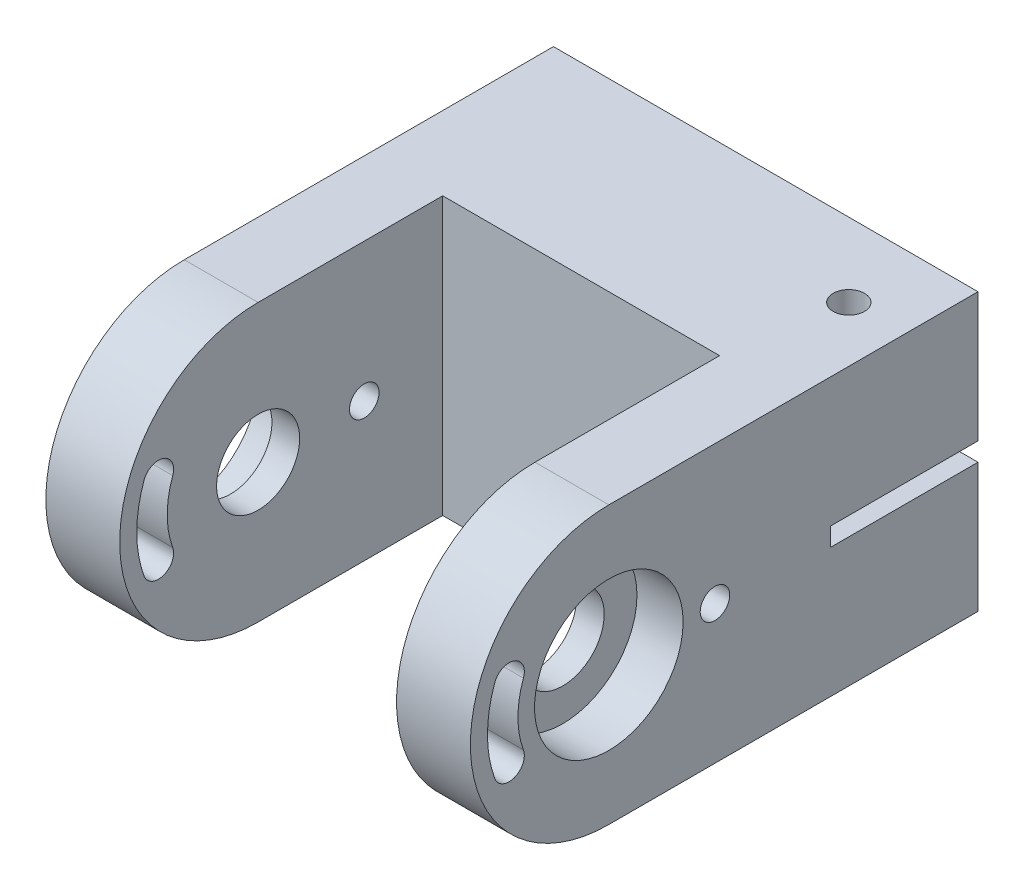
ISO-10303-21;
HEADER;
FILE_DESCRIPTION(('STEP AP214'),'2;1');
FILE_NAME('part.step','',(''),(''),'','','');
FILE_SCHEMA(('AUTOMOTIVE_DESIGN { 1 0 10303 214 1 1 1 1 }'));
ENDSEC;
DATA;
#1=APPLICATION_CONTEXT('core data for automotive mechanical design processes');
#2=APPLICATION_PROTOCOL_DEFINITION('international standard','automotive_design',2000,#1);
#3=PRODUCT_CONTEXT('',#1,'mechanical');
#4=PRODUCT('Part','Part','',(#3));
#5=PRODUCT_RELATED_PRODUCT_CATEGORY('part','',(#4));
#6=PRODUCT_DEFINITION_FORMATION('','',#4);
#7=PRODUCT_DEFINITION_CONTEXT('part definition',#1,'design');
#8=PRODUCT_DEFINITION('design','',#6,#7);
#9=PRODUCT_DEFINITION_SHAPE('','',#8);
#10=(LENGTH_UNIT() NAMED_UNIT(*) SI_UNIT(.MILLI.,.METRE.));
#11=(NAMED_UNIT(*) PLANE_ANGLE_UNIT() SI_UNIT($,.RADIAN.));
#12=(NAMED_UNIT(*) SI_UNIT($,.STERADIAN.) SOLID_ANGLE_UNIT());
#13=UNCERTAINTY_MEASURE_WITH_UNIT(LENGTH_MEASURE(1.E-05),#10,'distance_accuracy_value','');
#14=(GEOMETRIC_REPRESENTATION_CONTEXT(3) GLOBAL_UNCERTAINTY_ASSIGNED_CONTEXT((#13)) GLOBAL_UNIT_ASSIGNED_CONTEXT((#10,
#11,#12)) REPRESENTATION_CONTEXT('',''));
#15=CARTESIAN_POINT('',(0.,0.,0.));
#16=DIRECTION('',(0.,0.,1.));
#17=DIRECTION('',(1.,0.,0.));
#18=AXIS2_PLACEMENT_3D('',#15,#16,#17);
#19=CARTESIAN_POINT('',(18.,0.,0.));
#20=DIRECTION('',(1.,0.,0.));
#21=DIRECTION('',(0.,1.,0.));
#22=AXIS2_PLACEMENT_3D('',#19,#20,#21);
#23=PLANE('',#22);
#24=CARTESIAN_POINT('',(18.,0.,0.));
#25=DIRECTION('',(1.,0.,0.));
#26=DIRECTION('',(0.,0.,-1.));
#27=AXIS2_PLACEMENT_3D('',#24,#25,#26);
#28=CIRCLE('',#27,4.5);
#29=CARTESIAN_POINT('',(18.,0.,-4.5));
#30=VERTEX_POINT('',#29);
#31=EDGE_CURVE('E11',#30,#30,#28,.T.);
#32=ORIENTED_EDGE('',*,*,#31,.F.);
#33=EDGE_LOOP('',(#32));
#34=FACE_BOUND('',#33,.T.);
#35=CARTESIAN_POINT('',(18.,0.,0.));
#36=DIRECTION('',(1.,0.,0.));
#37=DIRECTION('',(0.,0.,-1.));
#38=AXIS2_PLACEMENT_3D('',#35,#36,#37);
#39=CIRCLE('',#38,8.05);
#40=CARTESIAN_POINT('',(18.,0.,-8.05));
#41=VERTEX_POINT('',#40);
#42=EDGE_CURVE('E26',#41,#41,#39,.T.);
#43=ORIENTED_EDGE('',*,*,#42,.T.);
#44=EDGE_LOOP('',(#43));
#45=FACE_BOUND('',#44,.T.);
#46=ADVANCED_FACE('F17',(#34,#45),#23,.T.);
#47=CARTESIAN_POINT('',(0.,0.,-22.));
#48=DIRECTION('',(0.,0.,1.));
#49=DIRECTION('',(1.,0.,0.));
#50=AXIS2_PLACEMENT_3D('',#47,#48,#49);
#51=PLANE('',#50);
#52=CARTESIAN_POINT('',(0.,0.,-22.));
#53=DIRECTION('',(0.,0.,1.));
#54=DIRECTION('',(1.,0.,0.));
#55=AXIS2_PLACEMENT_3D('',#52,#53,#54);
#56=CIRCLE('',#55,6.05);
#57=CARTESIAN_POINT('',(6.05,0.,-22.));
#58=VERTEX_POINT('',#57);
#59=EDGE_CURVE('E280',#58,#58,#56,.T.);
#60=ORIENTED_EDGE('',*,*,#59,.F.);
#61=EDGE_LOOP('',(#60));
#62=FACE_BOUND('',#61,.T.);
#63=ADVANCED_FACE('F520',(#62),#51,.F.);
#64=CARTESIAN_POINT('',(-27.,0.,0.));
#65=DIRECTION('',(1.,0.,0.));
#66=DIRECTION('',(0.,0.,-1.));
#67=AXIS2_PLACEMENT_3D('',#64,#65,#66);
#68=CYLINDRICAL_SURFACE('',#67,4.5);
#69=CARTESIAN_POINT('',(-15.,0.,0.));
#70=DIRECTION('',(1.,0.,0.));
#71=DIRECTION('',(0.,0.,-1.));
#72=AXIS2_PLACEMENT_3D('',#69,#70,#71);
#73=CIRCLE('',#72,4.5);
#74=CARTESIAN_POINT('',(-15.,0.,-4.5));
#75=VERTEX_POINT('',#74);
#76=EDGE_CURVE('E429',#75,#75,#73,.T.);
#77=ORIENTED_EDGE('',*,*,#76,.T.);
#78=EDGE_LOOP('',(#77));
#79=FACE_BOUND('',#78,.T.);
#80=CARTESIAN_POINT('',(-18.,0.,0.));
#81=DIRECTION('',(1.,0.,0.));
#82=DIRECTION('',(0.,0.,-1.));
#83=AXIS2_PLACEMENT_3D('',#80,#81,#82);
#84=CIRCLE('',#83,4.5);
#85=CARTESIAN_POINT('',(-18.,0.,-4.5));
#86=VERTEX_POINT('',#85);
#87=EDGE_CURVE('E279',#86,#86,#84,.T.);
#88=ORIENTED_EDGE('',*,*,#87,.F.);
#89=EDGE_LOOP('',(#88));
#90=FACE_BOUND('',#89,.T.);
#91=ADVANCED_FACE('F525',(#79,#90),#68,.F.);
#92=CARTESIAN_POINT('',(11.,0.,0.));
#93=DIRECTION('',(1.,0.,0.));
#94=DIRECTION('',(0.,0.,-1.));
#95=AXIS2_PLACEMENT_3D('',#92,#93,#94);
#96=CYLINDRICAL_SURFACE('',#95,4.5);
#97=ORIENTED_EDGE('',*,*,#31,.T.);
#98=EDGE_LOOP('',(#97));
#99=FACE_BOUND('',#98,.T.);
#100=CARTESIAN_POINT('',(15.,0.,0.));
#101=DIRECTION('',(1.,0.,0.));
#102=DIRECTION('',(0.,0.,-1.));
#103=AXIS2_PLACEMENT_3D('',#100,#101,#102);
#104=CIRCLE('',#103,4.5);
#105=CARTESIAN_POINT('',(15.,0.,-4.5));
#106=VERTEX_POINT('',#105);
#107=EDGE_CURVE('E338',#106,#106,#104,.T.);
#108=ORIENTED_EDGE('',*,*,#107,.F.);
#109=EDGE_LOOP('',(#108));
#110=FACE_BOUND('',#109,.T.);
#111=ADVANCED_FACE('F533',(#99,#110),#96,.F.);
#112=CARTESIAN_POINT('',(18.,0.,0.));
#113=DIRECTION('',(1.,0.,0.));
#114=DIRECTION('',(0.,0.,-1.));
#115=AXIS2_PLACEMENT_3D('',#112,#113,#114);
#116=CYLINDRICAL_SURFACE('',#115,8.05);
#117=CARTESIAN_POINT('',(23.,0.,0.));
#118=DIRECTION('',(1.,0.,0.));
#119=DIRECTION('',(0.,0.,-1.));
#120=AXIS2_PLACEMENT_3D('',#117,#118,#119);
#121=CIRCLE('',#120,8.05);
#122=CARTESIAN_POINT('',(23.,0.,-8.05));
#123=VERTEX_POINT('',#122);
#124=EDGE_CURVE('E332',#123,#123,#121,.T.);
#125=ORIENTED_EDGE('',*,*,#124,.T.);
#126=EDGE_LOOP('',(#125));
#127=FACE_BOUND('',#126,.T.);
#128=ORIENTED_EDGE('',*,*,#42,.F.);
#129=EDGE_LOOP('',(#128));
#130=FACE_BOUND('',#129,.T.);
#131=ADVANCED_FACE('F531',(#127,#130),#116,.F.);
#132=CARTESIAN_POINT('',(7.,0.,-11.5));
#133=DIRECTION('',(1.,0.,0.));
#134=DIRECTION('',(0.,1.,0.));
#135=AXIS2_PLACEMENT_3D('',#132,#133,#134);
#136=CYLINDRICAL_SURFACE('',#135,1.6);
#137=CARTESIAN_POINT('',(23.,0.,-11.5));
#138=DIRECTION('',(1.,0.,0.));
#139=DIRECTION('',(0.,1.,0.));
#140=AXIS2_PLACEMENT_3D('',#137,#138,#139);
#141=CIRCLE('',#140,1.6);
#142=CARTESIAN_POINT('',(23.,1.6,-11.5));
#143=VERTEX_POINT('',#142);
#144=EDGE_CURVE('E437',#143,#143,#141,.T.);
#145=ORIENTED_EDGE('',*,*,#144,.T.);
#146=EDGE_LOOP('',(#145));
#147=FACE_BOUND('',#146,.T.);
#148=CARTESIAN_POINT('',(15.,0.,-11.5));
#149=DIRECTION('',(1.,0.,0.));
#150=DIRECTION('',(0.,1.,0.));
#151=AXIS2_PLACEMENT_3D('',#148,#149,#150);
#152=CIRCLE('',#151,1.6);
#153=CARTESIAN_POINT('',(15.,1.6,-11.5));
#154=VERTEX_POINT('',#153);
#155=EDGE_CURVE('E343',#154,#154,#152,.T.);
#156=ORIENTED_EDGE('',*,*,#155,.F.);
#157=EDGE_LOOP('',(#156));
#158=FACE_BOUND('',#157,.T.);
#159=ADVANCED_FACE('F517',(#147,#158),#136,.F.);
#160=CARTESIAN_POINT('',(7.,0.,0.));
#161=DIRECTION('',(-1.,0.,0.));
#162=DIRECTION('',(0.,1.,0.));
#163=AXIS2_PLACEMENT_3D('',#160,#161,#162);
#164=CYLINDRICAL_SURFACE('',#163,13.15);
#165=DIRECTION('',(1.,0.,0.));
#166=VECTOR('',#165,1.);
#167=CARTESIAN_POINT('',(7.,-4.497564884733,12.356957963335));
#168=LINE('',#167,#166);
#169=CARTESIAN_POINT('',(15.,-4.497564884733,12.356957963335));
#170=VERTEX_POINT('',#169);
#171=CARTESIAN_POINT('',(23.,-4.497564884733,12.356957963335));
#172=VERTEX_POINT('',#171);
#173=EDGE_CURVE('E456',#170,#172,#168,.T.);
#174=ORIENTED_EDGE('',*,*,#173,.F.);
#175=CARTESIAN_POINT('',(15.,0.,0.));
#176=DIRECTION('',(-1.,0.,0.));
#177=DIRECTION('',(0.,1.,0.));
#178=AXIS2_PLACEMENT_3D('',#175,#176,#177);
#179=CIRCLE('',#178,13.15);
#180=CARTESIAN_POINT('',(15.,4.497564884733,12.356957963335));
#181=VERTEX_POINT('',#180);
#182=EDGE_CURVE('E420',#170,#181,#179,.T.);
#183=ORIENTED_EDGE('',*,*,#182,.T.);
#184=DIRECTION('',(1.,0.,0.));
#185=VECTOR('',#184,1.);
#186=CARTESIAN_POINT('',(7.,4.497564884733,12.356957963335));
#187=LINE('',#186,#185);
#188=CARTESIAN_POINT('',(23.,4.497564884733,12.356957963335));
#189=VERTEX_POINT('',#188);
#190=EDGE_CURVE('E453',#181,#189,#187,.T.);
#191=ORIENTED_EDGE('',*,*,#190,.T.);
#192=CARTESIAN_POINT('',(23.,0.,0.));
#193=DIRECTION('',(-1.,0.,0.));
#194=DIRECTION('',(0.,1.,0.));
#195=AXIS2_PLACEMENT_3D('',#192,#193,#194);
#196=CIRCLE('',#195,13.15);
#197=EDGE_CURVE('E426',#172,#189,#196,.T.);
#198=ORIENTED_EDGE('',*,*,#197,.F.);
#199=EDGE_LOOP('',(#174,#183,#191,#198));
#200=FACE_BOUND('',#199,.T.);
#201=ADVANCED_FACE('F496',(#200),#164,.F.);
#202=CARTESIAN_POINT('',(7.,3.933231648245,10.806465139038));
#203=DIRECTION('',(-1.,0.,0.));
#204=DIRECTION('',(0.,-0.939692620785813,0.342020143325932));
#205=AXIS2_PLACEMENT_3D('',#202,#203,#204);
#206=CYLINDRICAL_SURFACE('',#205,1.65);
#207=DIRECTION('',(1.,0.,0.));
#208=VECTOR('',#207,1.);
#209=CARTESIAN_POINT('',(7.,3.368898411758,9.255972314741));
#210=LINE('',#209,#208);
#211=CARTESIAN_POINT('',(15.,3.368898411758,9.255972314741));
#212=VERTEX_POINT('',#211);
#213=CARTESIAN_POINT('',(23.,3.368898411758,9.255972314741));
#214=VERTEX_POINT('',#213);
#215=EDGE_CURVE('E402',#212,#214,#210,.T.);
#216=ORIENTED_EDGE('',*,*,#215,.T.);
#217=CARTESIAN_POINT('',(23.,3.933231648245,10.806465139038));
#218=DIRECTION('',(-1.,0.,0.));
#219=DIRECTION('',(0.,-0.939692620785813,0.342020143325932));
#220=AXIS2_PLACEMENT_3D('',#217,#218,#219);
#221=CIRCLE('',#220,1.65);
#222=EDGE_CURVE('E433',#189,#214,#221,.T.);
#223=ORIENTED_EDGE('',*,*,#222,.F.);
#224=ORIENTED_EDGE('',*,*,#190,.F.);
#225=CARTESIAN_POINT('',(15.,3.933231648245,10.806465139038));
#226=DIRECTION('',(-1.,0.,0.));
#227=DIRECTION('',(0.,-0.939692620785813,0.342020143325932));
#228=AXIS2_PLACEMENT_3D('',#225,#226,#227);
#229=CIRCLE('',#228,1.65);
#230=EDGE_CURVE('E416',#181,#212,#229,.T.);
#231=ORIENTED_EDGE('',*,*,#230,.T.);
#232=EDGE_LOOP('',(#216,#223,#224,#231));
#233=FACE_BOUND('',#232,.T.);
#234=ADVANCED_FACE('F508',(#233),#206,.F.);
#235=CARTESIAN_POINT('',(7.,-3.933231648245,10.806465139038));
#236=DIRECTION('',(-1.,0.,0.));
#237=DIRECTION('',(0.,0.939692620785813,0.342020143325932));
#238=AXIS2_PLACEMENT_3D('',#235,#236,#237);
#239=CYLINDRICAL_SURFACE('',#238,1.65);
#240=ORIENTED_EDGE('',*,*,#173,.T.);
#241=CARTESIAN_POINT('',(23.,-3.933231648245,10.806465139038));
#242=DIRECTION('',(-1.,0.,0.));
#243=DIRECTION('',(0.,0.939692620785813,0.342020143325932));
#244=AXIS2_PLACEMENT_3D('',#241,#242,#243);
#245=CIRCLE('',#244,1.65);
#246=CARTESIAN_POINT('',(23.,-3.368898411758,9.255972314741));
#247=VERTEX_POINT('',#246);
#248=EDGE_CURVE('E271',#247,#172,#245,.T.);
#249=ORIENTED_EDGE('',*,*,#248,.F.);
#250=DIRECTION('',(1.,0.,0.));
#251=VECTOR('',#250,1.);
#252=CARTESIAN_POINT('',(7.,-3.368898411758,9.255972314741));
#253=LINE('',#252,#251);
#254=CARTESIAN_POINT('',(15.,-3.368898411758,9.255972314741));
#255=VERTEX_POINT('',#254);
#256=EDGE_CURVE('E309',#255,#247,#253,.T.);
#257=ORIENTED_EDGE('',*,*,#256,.F.);
#258=CARTESIAN_POINT('',(15.,-3.933231648245,10.806465139038));
#259=DIRECTION('',(-1.,0.,0.));
#260=DIRECTION('',(0.,0.939692620785813,0.342020143325932));
#261=AXIS2_PLACEMENT_3D('',#258,#259,#260);
#262=CIRCLE('',#261,1.65);
#263=EDGE_CURVE('E449',#255,#170,#262,.T.);
#264=ORIENTED_EDGE('',*,*,#263,.T.);
#265=EDGE_LOOP('',(#240,#249,#257,#264));
#266=FACE_BOUND('',#265,.T.);
#267=ADVANCED_FACE('F492',(#266),#239,.F.);
#268=CARTESIAN_POINT('',(7.,0.,0.));
#269=DIRECTION('',(-1.,0.,0.));
#270=DIRECTION('',(0.,1.,0.));
#271=AXIS2_PLACEMENT_3D('',#268,#269,#270);
#272=CYLINDRICAL_SURFACE('',#271,9.85);
#273=ORIENTED_EDGE('',*,*,#256,.T.);
#274=CARTESIAN_POINT('',(23.,0.,0.));
#275=DIRECTION('',(-1.,0.,0.));
#276=DIRECTION('',(0.,1.,0.));
#277=AXIS2_PLACEMENT_3D('',#274,#275,#276);
#278=CIRCLE('',#277,9.85);
#279=EDGE_CURVE('E267',#247,#214,#278,.T.);
#280=ORIENTED_EDGE('',*,*,#279,.T.);
#281=ORIENTED_EDGE('',*,*,#215,.F.);
#282=CARTESIAN_POINT('',(15.,0.,0.));
#283=DIRECTION('',(-1.,0.,0.));
#284=DIRECTION('',(0.,1.,0.));
#285=AXIS2_PLACEMENT_3D('',#282,#283,#284);
#286=CIRCLE('',#285,9.85);
#287=EDGE_CURVE('E460',#255,#212,#286,.T.);
#288=ORIENTED_EDGE('',*,*,#287,.F.);
#289=EDGE_LOOP('',(#273,#280,#281,#288));
#290=FACE_BOUND('',#289,.T.);
#291=ADVANCED_FACE('F501',(#290),#272,.T.);
#292=CARTESIAN_POINT('',(3.,-1.,-24.));
#293=DIRECTION('',(0.,0.,1.));
#294=DIRECTION('',(1.,0.,0.));
#295=AXIS2_PLACEMENT_3D('',#292,#293,#294);
#296=PLANE('',#295);
#297=DIRECTION('',(0.,-1.,0.));
#298=VECTOR('',#297,1.);
#299=CARTESIAN_POINT('',(23.,-8.,-24.));
#300=LINE('',#299,#298);
#301=CARTESIAN_POINT('',(23.,1.,-24.));
#302=VERTEX_POINT('',#301);
#303=CARTESIAN_POINT('',(23.,-1.,-24.));
#304=VERTEX_POINT('',#303);
#305=EDGE_CURVE('E382',#302,#304,#300,.T.);
#306=ORIENTED_EDGE('',*,*,#305,.T.);
#307=DIRECTION('',(1.,0.,0.));
#308=VECTOR('',#307,1.);
#309=CARTESIAN_POINT('',(3.,-1.,-24.));
#310=LINE('',#309,#308);
#311=CARTESIAN_POINT('',(5.966783052869,-1.,-24.));
#312=VERTEX_POINT('',#311);
#313=EDGE_CURVE('E37',#312,#304,#310,.T.);
#314=ORIENTED_EDGE('',*,*,#313,.F.);
#315=CARTESIAN_POINT('',(0.,0.,-24.));
#316=DIRECTION('',(0.,0.,1.));
#317=DIRECTION('',(1.,0.,0.));
#318=AXIS2_PLACEMENT_3D('',#315,#316,#317);
#319=CIRCLE('',#318,6.05);
#320=CARTESIAN_POINT('',(5.966783052869,1.,-24.));
#321=VERTEX_POINT('',#320);
#322=EDGE_CURVE('E374',#312,#321,#319,.T.);
#323=ORIENTED_EDGE('',*,*,#322,.T.);
#324=DIRECTION('',(1.,0.,0.));
#325=VECTOR('',#324,1.);
#326=CARTESIAN_POINT('',(3.,1.,-24.));
#327=LINE('',#326,#325);
#328=EDGE_CURVE('E327',#321,#302,#327,.T.);
#329=ORIENTED_EDGE('',*,*,#328,.T.);
#330=EDGE_LOOP('',(#306,#314,#323,#329));
#331=FACE_BOUND('',#330,.T.);
#332=ADVANCED_FACE('F557',(#331),#296,.F.);
#333=CARTESIAN_POINT('',(-18.,0.,0.));
#334=DIRECTION('',(1.,0.,0.));
#335=DIRECTION('',(0.,1.,0.));
#336=AXIS2_PLACEMENT_3D('',#333,#334,#335);
#337=PLANE('',#336);
#338=ORIENTED_EDGE('',*,*,#87,.T.);
#339=EDGE_LOOP('',(#338));
#340=FACE_BOUND('',#339,.T.);
#341=CARTESIAN_POINT('',(-18.,0.,0.));
#342=DIRECTION('',(1.,0.,0.));
#343=DIRECTION('',(0.,0.,-1.));
#344=AXIS2_PLACEMENT_3D('',#341,#342,#343);
#345=CIRCLE('',#344,8.05);
#346=CARTESIAN_POINT('',(-18.,0.,-8.05));
#347=VERTEX_POINT('',#346);
#348=EDGE_CURVE('E406',#347,#347,#345,.T.);
#349=ORIENTED_EDGE('',*,*,#348,.F.);
#350=EDGE_LOOP('',(#349));
#351=FACE_BOUND('',#350,.T.);
#352=ADVANCED_FACE('F553',(#340,#351),#337,.F.);
#353=CARTESIAN_POINT('',(17.,16.,-32.));
#354=DIRECTION('',(0.,-1.,0.));
#355=DIRECTION('',(1.,0.,0.));
#356=AXIS2_PLACEMENT_3D('',#353,#354,#355);
#357=CYLINDRICAL_SURFACE('',#356,1.7);
#358=CARTESIAN_POINT('',(17.,1.,-32.));
#359=DIRECTION('',(0.,-1.,0.));
#360=DIRECTION('',(1.,0.,0.));
#361=AXIS2_PLACEMENT_3D('',#358,#359,#360);
#362=CIRCLE('',#361,1.7);
#363=CARTESIAN_POINT('',(18.7,1.,-32.));
#364=VERTEX_POINT('',#363);
#365=EDGE_CURVE('E326',#364,#364,#362,.T.);
#366=ORIENTED_EDGE('',*,*,#365,.T.);
#367=EDGE_LOOP('',(#366));
#368=FACE_BOUND('',#367,.T.);
#369=CARTESIAN_POINT('',(17.,15.,-32.));
#370=DIRECTION('',(0.,-1.,0.));
#371=DIRECTION('',(1.,0.,0.));
#372=AXIS2_PLACEMENT_3D('',#369,#370,#371);
#373=CIRCLE('',#372,1.7);
#374=CARTESIAN_POINT('',(18.7,15.,-32.));
#375=VERTEX_POINT('',#374);
#376=EDGE_CURVE('E357',#375,#375,#373,.T.);
#377=ORIENTED_EDGE('',*,*,#376,.F.);
#378=EDGE_LOOP('',(#377));
#379=FACE_BOUND('',#378,.T.);
#380=ADVANCED_FACE('F556',(#368,#379),#357,.F.);
#381=CARTESIAN_POINT('',(3.,-1.,-40.));
#382=DIRECTION('',(0.,1.,0.));
#383=DIRECTION('',(1.,0.,0.));
#384=AXIS2_PLACEMENT_3D('',#381,#382,#383);
#385=PLANE('',#384);
#386=CARTESIAN_POINT('',(17.,-1.,-32.));
#387=DIRECTION('',(0.,-1.,0.));
#388=DIRECTION('',(1.,0.,0.));
#389=AXIS2_PLACEMENT_3D('',#386,#387,#388);
#390=CIRCLE('',#389,1.7);
#391=CARTESIAN_POINT('',(18.7,-1.,-32.));
#392=VERTEX_POINT('',#391);
#393=EDGE_CURVE('E470',#392,#392,#390,.T.);
#394=ORIENTED_EDGE('',*,*,#393,.T.);
#395=EDGE_LOOP('',(#394));
#396=FACE_BOUND('',#395,.T.);
#397=DIRECTION('',(1.,0.,0.));
#398=VECTOR('',#397,1.);
#399=CARTESIAN_POINT('',(3.,-1.,-40.));
#400=LINE('',#399,#398);
#401=CARTESIAN_POINT('',(5.966783052869,-1.,-40.));
#402=VERTEX_POINT('',#401);
#403=CARTESIAN_POINT('',(23.,-1.,-40.));
#404=VERTEX_POINT('',#403);
#405=EDGE_CURVE('E317',#402,#404,#400,.T.);
#406=ORIENTED_EDGE('',*,*,#405,.F.);
#407=DIRECTION('',(0.,0.,1.));
#408=VECTOR('',#407,1.);
#409=CARTESIAN_POINT('',(5.966783052869,-1.,-40.));
#410=LINE('',#409,#408);
#411=EDGE_CURVE('E474',#402,#312,#410,.T.);
#412=ORIENTED_EDGE('',*,*,#411,.T.);
#413=ORIENTED_EDGE('',*,*,#313,.T.);
#414=DIRECTION('',(0.,0.,1.));
#415=VECTOR('',#414,1.);
#416=CARTESIAN_POINT('',(23.,-1.,-40.));
#417=LINE('',#416,#415);
#418=EDGE_CURVE('E410',#404,#304,#417,.T.);
#419=ORIENTED_EDGE('',*,*,#418,.F.);
#420=EDGE_LOOP('',(#406,#412,#413,#419));
#421=FACE_BOUND('',#420,.T.);
#422=ADVANCED_FACE('F626',(#396,#421),#385,.T.);
#423=CARTESIAN_POINT('',(0.,0.,-40.));
#424=DIRECTION('',(0.,0.,1.));
#425=DIRECTION('',(1.,0.,0.));
#426=AXIS2_PLACEMENT_3D('',#423,#424,#425);
#427=CYLINDRICAL_SURFACE('',#426,6.05);
#428=ORIENTED_EDGE('',*,*,#59,.T.);
#429=EDGE_LOOP('',(#428));
#430=FACE_BOUND('',#429,.T.);
#431=ORIENTED_EDGE('',*,*,#322,.F.);
#432=ORIENTED_EDGE('',*,*,#411,.F.);
#433=CARTESIAN_POINT('',(0.,0.,-40.));
#434=DIRECTION('',(0.,0.,1.));
#435=DIRECTION('',(1.,0.,0.));
#436=AXIS2_PLACEMENT_3D('',#433,#434,#435);
#437=CIRCLE('',#436,6.05);
#438=CARTESIAN_POINT('',(5.966783052869,1.,-40.));
#439=VERTEX_POINT('',#438);
#440=EDGE_CURVE('E313',#439,#402,#437,.T.);
#441=ORIENTED_EDGE('',*,*,#440,.F.);
#442=DIRECTION('',(0.,0.,1.));
#443=VECTOR('',#442,1.);
#444=CARTESIAN_POINT('',(5.966783052869,1.,-40.));
#445=LINE('',#444,#443);
#446=EDGE_CURVE('E322',#439,#321,#445,.T.);
#447=ORIENTED_EDGE('',*,*,#446,.T.);
#448=EDGE_LOOP('',(#431,#432,#441,#447));
#449=FACE_BOUND('',#448,.T.);
#450=ADVANCED_FACE('F624',(#430,#449),#427,.F.);
#451=CARTESIAN_POINT('',(3.,1.,-40.));
#452=DIRECTION('',(0.,1.,0.));
#453=DIRECTION('',(1.,0.,0.));
#454=AXIS2_PLACEMENT_3D('',#451,#452,#453);
#455=PLANE('',#454);
#456=ORIENTED_EDGE('',*,*,#365,.F.);
#457=EDGE_LOOP('',(#456));
#458=FACE_BOUND('',#457,.T.);
#459=DIRECTION('',(0.,0.,1.));
#460=VECTOR('',#459,1.);
#461=CARTESIAN_POINT('',(23.,1.,-40.));
#462=LINE('',#461,#460);
#463=CARTESIAN_POINT('',(23.,1.,-40.));
#464=VERTEX_POINT('',#463);
#465=EDGE_CURVE('E378',#464,#302,#462,.T.);
#466=ORIENTED_EDGE('',*,*,#465,.T.);
#467=ORIENTED_EDGE('',*,*,#328,.F.);
#468=ORIENTED_EDGE('',*,*,#446,.F.);
#469=DIRECTION('',(1.,0.,0.));
#470=VECTOR('',#469,1.);
#471=CARTESIAN_POINT('',(3.,1.,-40.));
#472=LINE('',#471,#470);
#473=EDGE_CURVE('E305',#439,#464,#472,.T.);
#474=ORIENTED_EDGE('',*,*,#473,.T.);
#475=EDGE_LOOP('',(#466,#467,#468,#474));
#476=FACE_BOUND('',#475,.T.);
#477=ADVANCED_FACE('F619',(#458,#476),#455,.F.);
#478=CARTESIAN_POINT('',(17.,16.,-32.));
#479=DIRECTION('',(0.,-1.,0.));
#480=DIRECTION('',(1.,0.,0.));
#481=AXIS2_PLACEMENT_3D('',#478,#479,#480);
#482=CYLINDRICAL_SURFACE('',#481,1.7);
#483=CARTESIAN_POINT('',(17.,-15.,-32.));
#484=DIRECTION('',(0.,-1.,0.));
#485=DIRECTION('',(1.,0.,0.));
#486=AXIS2_PLACEMENT_3D('',#483,#484,#485);
#487=CIRCLE('',#486,1.7);
#488=CARTESIAN_POINT('',(18.7,-15.,-32.));
#489=VERTEX_POINT('',#488);
#490=EDGE_CURVE('E297',#489,#489,#487,.T.);
#491=ORIENTED_EDGE('',*,*,#490,.T.);
#492=EDGE_LOOP('',(#491));
#493=FACE_BOUND('',#492,.T.);
#494=ORIENTED_EDGE('',*,*,#393,.F.);
#495=EDGE_LOOP('',(#494));
#496=FACE_BOUND('',#495,.T.);
#497=ADVANCED_FACE('F661',(#493,#496),#482,.F.);
#498=CARTESIAN_POINT('',(-23.,-15.,-20.));
#499=DIRECTION('',(0.,0.,1.));
#500=DIRECTION('',(1.,0.,0.));
#501=AXIS2_PLACEMENT_3D('',#498,#499,#500);
#502=PLANE('',#501);
#503=DIRECTION('',(1.,0.,0.));
#504=VECTOR('',#503,1.);
#505=CARTESIAN_POINT('',(-23.,15.,-20.));
#506=LINE('',#505,#504);
#507=CARTESIAN_POINT('',(-15.,15.,-20.));
#508=VERTEX_POINT('',#507);
#509=CARTESIAN_POINT('',(15.,15.,-20.));
#510=VERTEX_POINT('',#509);
#511=EDGE_CURVE('E290',#508,#510,#506,.T.);
#512=ORIENTED_EDGE('',*,*,#511,.F.);
#513=DIRECTION('',(0.,1.,0.));
#514=VECTOR('',#513,1.);
#515=CARTESIAN_POINT('',(-15.,-15.,-20.));
#516=LINE('',#515,#514);
#517=CARTESIAN_POINT('',(-15.,-15.,-20.));
#518=VERTEX_POINT('',#517);
#519=EDGE_CURVE('E342',#518,#508,#516,.T.);
#520=ORIENTED_EDGE('',*,*,#519,.F.);
#521=DIRECTION('',(1.,0.,0.));
#522=VECTOR('',#521,1.);
#523=CARTESIAN_POINT('',(-23.,-15.,-20.));
#524=LINE('',#523,#522);
#525=CARTESIAN_POINT('',(15.,-15.,-20.));
#526=VERTEX_POINT('',#525);
#527=EDGE_CURVE('E266',#518,#526,#524,.T.);
#528=ORIENTED_EDGE('',*,*,#527,.T.);
#529=DIRECTION('',(0.,1.,0.));
#530=VECTOR('',#529,1.);
#531=CARTESIAN_POINT('',(15.,-15.,-20.));
#532=LINE('',#531,#530);
#533=EDGE_CURVE('E331',#526,#510,#532,.T.);
#534=ORIENTED_EDGE('',*,*,#533,.T.);
#535=EDGE_LOOP('',(#512,#520,#528,#534));
#536=FACE_BOUND('',#535,.T.);
#537=ADVANCED_FACE('F597',(#536),#502,.T.);
#538=CARTESIAN_POINT('',(-15.,-15.,-20.));
#539=DIRECTION('',(1.,0.,0.));
#540=DIRECTION('',(0.,1.,0.));
#541=AXIS2_PLACEMENT_3D('',#538,#539,#540);
#542=PLANE('',#541);
#543=ORIENTED_EDGE('',*,*,#76,.F.);
#544=EDGE_LOOP('',(#543));
#545=FACE_BOUND('',#544,.T.);
#546=CARTESIAN_POINT('',(-15.,0.,-11.5));
#547=DIRECTION('',(1.,0.,0.));
#548=DIRECTION('',(0.,1.,0.));
#549=AXIS2_PLACEMENT_3D('',#546,#547,#548);
#550=CIRCLE('',#549,1.6);
#551=CARTESIAN_POINT('',(-15.,1.6,-11.5));
#552=VERTEX_POINT('',#551);
#553=EDGE_CURVE('E399',#552,#552,#550,.T.);
#554=ORIENTED_EDGE('',*,*,#553,.F.);
#555=EDGE_LOOP('',(#554));
#556=FACE_BOUND('',#555,.T.);
#557=CARTESIAN_POINT('',(-15.,0.,0.));
#558=DIRECTION('',(-1.,0.,0.));
#559=DIRECTION('',(0.,1.,0.));
#560=AXIS2_PLACEMENT_3D('',#557,#558,#559);
#561=CIRCLE('',#560,9.85);
#562=CARTESIAN_POINT('',(-15.,-3.368898411758,9.255972314741));
#563=VERTEX_POINT('',#562);
#564=CARTESIAN_POINT('',(-15.,3.368898411758,9.255972314741));
#565=VERTEX_POINT('',#564);
#566=EDGE_CURVE('E351',#563,#565,#561,.T.);
#567=ORIENTED_EDGE('',*,*,#566,.F.);
#568=CARTESIAN_POINT('',(-15.,-3.933231648245,10.806465139038));
#569=DIRECTION('',(-1.,0.,0.));
#570=DIRECTION('',(0.,0.939692620785813,0.342020143325932));
#571=AXIS2_PLACEMENT_3D('',#568,#569,#570);
#572=CIRCLE('',#571,1.65);
#573=CARTESIAN_POINT('',(-15.,-4.497564884733,12.356957963335));
#574=VERTEX_POINT('',#573);
#575=EDGE_CURVE('E396',#563,#574,#572,.T.);
#576=ORIENTED_EDGE('',*,*,#575,.T.);
#577=CARTESIAN_POINT('',(-15.,0.,0.));
#578=DIRECTION('',(-1.,0.,0.));
#579=DIRECTION('',(0.,1.,0.));
#580=AXIS2_PLACEMENT_3D('',#577,#578,#579);
#581=CIRCLE('',#580,13.15);
#582=CARTESIAN_POINT('',(-15.,4.497564884733,12.356957963335));
#583=VERTEX_POINT('',#582);
#584=EDGE_CURVE('E393',#574,#583,#581,.T.);
#585=ORIENTED_EDGE('',*,*,#584,.T.);
#586=CARTESIAN_POINT('',(-15.,3.933231648245,10.806465139038));
#587=DIRECTION('',(-1.,0.,0.));
#588=DIRECTION('',(0.,-0.939692620785813,0.342020143325932));
#589=AXIS2_PLACEMENT_3D('',#586,#587,#588);
#590=CIRCLE('',#589,1.65);
#591=EDGE_CURVE('E350',#583,#565,#590,.T.);
#592=ORIENTED_EDGE('',*,*,#591,.T.);
#593=EDGE_LOOP('',(#567,#576,#585,#592));
#594=FACE_BOUND('',#593,.T.);
#595=DIRECTION('',(0.,0.,1.));
#596=VECTOR('',#595,1.);
#597=CARTESIAN_POINT('',(-15.,15.,-20.));
#598=LINE('',#597,#596);
#599=CARTESIAN_POINT('',(-15.,15.,0.));
#600=VERTEX_POINT('',#599);
#601=EDGE_CURVE('E205',#508,#600,#598,.T.);
#602=ORIENTED_EDGE('',*,*,#601,.T.);
#603=CARTESIAN_POINT('',(-15.,0.,0.));
#604=DIRECTION('',(1.,0.,0.));
#605=DIRECTION('',(0.,0.,-1.));
#606=AXIS2_PLACEMENT_3D('',#603,#604,#605);
#607=CIRCLE('',#606,15.);
#608=CARTESIAN_POINT('',(-15.,-15.,0.));
#609=VERTEX_POINT('',#608);
#610=EDGE_CURVE('E201',#600,#609,#607,.T.);
#611=ORIENTED_EDGE('',*,*,#610,.T.);
#612=DIRECTION('',(0.,0.,1.));
#613=VECTOR('',#612,1.);
#614=CARTESIAN_POINT('',(-15.,-15.,-20.));
#615=LINE('',#614,#613);
#616=EDGE_CURVE('E276',#518,#609,#615,.T.);
#617=ORIENTED_EDGE('',*,*,#616,.F.);
#618=ORIENTED_EDGE('',*,*,#519,.T.);
#619=EDGE_LOOP('',(#602,#611,#617,#618));
#620=FACE_BOUND('',#619,.T.);
#621=ADVANCED_FACE('F594',(#545,#556,#594,#620),#542,.T.);
#622=CARTESIAN_POINT('',(15.,-15.,-20.));
#623=DIRECTION('',(1.,0.,0.));
#624=DIRECTION('',(0.,1.,0.));
#625=AXIS2_PLACEMENT_3D('',#622,#623,#624);
#626=PLANE('',#625);
#627=ORIENTED_EDGE('',*,*,#107,.T.);
#628=EDGE_LOOP('',(#627));
#629=FACE_BOUND('',#628,.T.);
#630=ORIENTED_EDGE('',*,*,#155,.T.);
#631=EDGE_LOOP('',(#630));
#632=FACE_BOUND('',#631,.T.);
#633=ORIENTED_EDGE('',*,*,#230,.F.);
#634=ORIENTED_EDGE('',*,*,#182,.F.);
#635=ORIENTED_EDGE('',*,*,#263,.F.);
#636=ORIENTED_EDGE('',*,*,#287,.T.);
#637=EDGE_LOOP('',(#633,#634,#635,#636));
#638=FACE_BOUND('',#637,.T.);
#639=ORIENTED_EDGE('',*,*,#533,.F.);
#640=DIRECTION('',(0.,0.,1.));
#641=VECTOR('',#640,1.);
#642=CARTESIAN_POINT('',(15.,-15.,-20.));
#643=LINE('',#642,#641);
#644=CARTESIAN_POINT('',(15.,-15.,0.));
#645=VERTEX_POINT('',#644);
#646=EDGE_CURVE('E243',#526,#645,#643,.T.);
#647=ORIENTED_EDGE('',*,*,#646,.T.);
#648=CARTESIAN_POINT('',(15.,0.,0.));
#649=DIRECTION('',(1.,0.,0.));
#650=DIRECTION('',(0.,0.,-1.));
#651=AXIS2_PLACEMENT_3D('',#648,#649,#650);
#652=CIRCLE('',#651,15.);
#653=CARTESIAN_POINT('',(15.,15.,0.));
#654=VERTEX_POINT('',#653);
#655=EDGE_CURVE('E328',#654,#645,#652,.T.);
#656=ORIENTED_EDGE('',*,*,#655,.F.);
#657=DIRECTION('',(0.,0.,1.));
#658=VECTOR('',#657,1.);
#659=CARTESIAN_POINT('',(15.,15.,-20.));
#660=LINE('',#659,#658);
#661=EDGE_CURVE('E285',#510,#654,#660,.T.);
#662=ORIENTED_EDGE('',*,*,#661,.F.);
#663=EDGE_LOOP('',(#639,#647,#656,#662));
#664=FACE_BOUND('',#663,.T.);
#665=ADVANCED_FACE('F505',(#629,#632,#638,#664),#626,.F.);
#666=CARTESIAN_POINT('',(15.,0.,0.));
#667=DIRECTION('',(1.,0.,0.));
#668=DIRECTION('',(0.,0.,-1.));
#669=AXIS2_PLACEMENT_3D('',#666,#667,#668);
#670=CYLINDRICAL_SURFACE('',#669,15.);
#671=CARTESIAN_POINT('',(23.,0.,0.));
#672=DIRECTION('',(1.,0.,0.));
#673=DIRECTION('',(0.,0.,-1.));
#674=AXIS2_PLACEMENT_3D('',#671,#672,#673);
#675=CIRCLE('',#674,15.);
#676=CARTESIAN_POINT('',(23.,15.,0.));
#677=VERTEX_POINT('',#676);
#678=CARTESIAN_POINT('',(23.,-15.,0.));
#679=VERTEX_POINT('',#678);
#680=EDGE_CURVE('E272',#677,#679,#675,.T.);
#681=ORIENTED_EDGE('',*,*,#680,.F.);
#682=DIRECTION('',(1.,0.,0.));
#683=VECTOR('',#682,1.);
#684=CARTESIAN_POINT('',(15.,15.,0.));
#685=LINE('',#684,#683);
#686=EDGE_CURVE('E289',#654,#677,#685,.T.);
#687=ORIENTED_EDGE('',*,*,#686,.F.);
#688=ORIENTED_EDGE('',*,*,#655,.T.);
#689=DIRECTION('',(1.,0.,0.));
#690=VECTOR('',#689,1.);
#691=CARTESIAN_POINT('',(15.,-15.,0.));
#692=LINE('',#691,#690);
#693=EDGE_CURVE('E239',#645,#679,#692,.T.);
#694=ORIENTED_EDGE('',*,*,#693,.T.);
#695=EDGE_LOOP('',(#681,#687,#688,#694));
#696=FACE_BOUND('',#695,.T.);
#697=ADVANCED_FACE('F609',(#696),#670,.T.);
#698=CARTESIAN_POINT('',(23.,-15.,-40.));
#699=DIRECTION('',(1.,0.,0.));
#700=DIRECTION('',(0.,1.,0.));
#701=AXIS2_PLACEMENT_3D('',#698,#699,#700);
#702=PLANE('',#701);
#703=ORIENTED_EDGE('',*,*,#124,.F.);
#704=EDGE_LOOP('',(#703));
#705=FACE_BOUND('',#704,.T.);
#706=ORIENTED_EDGE('',*,*,#144,.F.);
#707=EDGE_LOOP('',(#706));
#708=FACE_BOUND('',#707,.T.);
#709=ORIENTED_EDGE('',*,*,#279,.F.);
#710=ORIENTED_EDGE('',*,*,#248,.T.);
#711=ORIENTED_EDGE('',*,*,#197,.T.);
#712=ORIENTED_EDGE('',*,*,#222,.T.);
#713=EDGE_LOOP('',(#709,#710,#711,#712));
#714=FACE_BOUND('',#713,.T.);
#715=DIRECTION('',(0.,0.,1.));
#716=VECTOR('',#715,1.);
#717=CARTESIAN_POINT('',(23.,-15.,-40.));
#718=LINE('',#717,#716);
#719=CARTESIAN_POINT('',(23.,-15.,-40.));
#720=VERTEX_POINT('',#719);
#721=EDGE_CURVE('E244',#720,#679,#718,.T.);
#722=ORIENTED_EDGE('',*,*,#721,.F.);
#723=DIRECTION('',(0.,1.,0.));
#724=VECTOR('',#723,1.);
#725=CARTESIAN_POINT('',(23.,-15.,-40.));
#726=LINE('',#725,#724);
#727=EDGE_CURVE('E321',#720,#404,#726,.T.);
#728=ORIENTED_EDGE('',*,*,#727,.T.);
#729=ORIENTED_EDGE('',*,*,#418,.T.);
#730=ORIENTED_EDGE('',*,*,#305,.F.);
#731=ORIENTED_EDGE('',*,*,#465,.F.);
#732=DIRECTION('',(0.,1.,0.));
#733=VECTOR('',#732,1.);
#734=CARTESIAN_POINT('',(23.,-15.,-40.));
#735=LINE('',#734,#733);
#736=CARTESIAN_POINT('',(23.,15.,-40.));
#737=VERTEX_POINT('',#736);
#738=EDGE_CURVE('E301',#464,#737,#735,.T.);
#739=ORIENTED_EDGE('',*,*,#738,.T.);
#740=DIRECTION('',(0.,0.,-1.));
#741=VECTOR('',#740,1.);
#742=CARTESIAN_POINT('',(23.,15.,0.));
#743=LINE('',#742,#741);
#744=EDGE_CURVE('E362',#677,#737,#743,.T.);
#745=ORIENTED_EDGE('',*,*,#744,.F.);
#746=ORIENTED_EDGE('',*,*,#680,.T.);
#747=EDGE_LOOP('',(#722,#728,#729,#730,#731,#739,#745,#746));
#748=FACE_BOUND('',#747,.T.);
#749=ADVANCED_FACE('F498',(#705,#708,#714,#748),#702,.T.);
#750=CARTESIAN_POINT('',(-23.01,0.,0.));
#751=DIRECTION('',(1.,0.,0.));
#752=DIRECTION('',(0.,0.,-1.));
#753=AXIS2_PLACEMENT_3D('',#750,#751,#752);
#754=CYLINDRICAL_SURFACE('',#753,8.05);
#755=ORIENTED_EDGE('',*,*,#348,.T.);
#756=EDGE_LOOP('',(#755));
#757=FACE_BOUND('',#756,.T.);
#758=CARTESIAN_POINT('',(-23.,0.,0.));
#759=DIRECTION('',(1.,0.,0.));
#760=DIRECTION('',(0.,0.,-1.));
#761=AXIS2_PLACEMENT_3D('',#758,#759,#760);
#762=CIRCLE('',#761,8.05);
#763=CARTESIAN_POINT('',(-23.,0.,-8.05));
#764=VERTEX_POINT('',#763);
#765=EDGE_CURVE('E252',#764,#764,#762,.T.);
#766=ORIENTED_EDGE('',*,*,#765,.F.);
#767=EDGE_LOOP('',(#766));
#768=FACE_BOUND('',#767,.T.);
#769=ADVANCED_FACE('F561',(#757,#768),#754,.F.);
#770=CARTESIAN_POINT('',(-31.,0.,-11.5));
#771=DIRECTION('',(1.,0.,0.));
#772=DIRECTION('',(0.,1.,0.));
#773=AXIS2_PLACEMENT_3D('',#770,#771,#772);
#774=CYLINDRICAL_SURFACE('',#773,1.6);
#775=ORIENTED_EDGE('',*,*,#553,.T.);
#776=EDGE_LOOP('',(#775));
#777=FACE_BOUND('',#776,.T.);
#778=CARTESIAN_POINT('',(-23.,0.,-11.5));
#779=DIRECTION('',(1.,0.,0.));
#780=DIRECTION('',(0.,1.,0.));
#781=AXIS2_PLACEMENT_3D('',#778,#779,#780);
#782=CIRCLE('',#781,1.6);
#783=CARTESIAN_POINT('',(-23.,1.6,-11.5));
#784=VERTEX_POINT('',#783);
#785=EDGE_CURVE('E256',#784,#784,#782,.T.);
#786=ORIENTED_EDGE('',*,*,#785,.F.);
#787=EDGE_LOOP('',(#786));
#788=FACE_BOUND('',#787,.T.);
#789=ADVANCED_FACE('F564',(#777,#788),#774,.F.);
#790=CARTESIAN_POINT('',(-31.,-3.933231648245,10.806465139038));
#791=DIRECTION('',(-1.,0.,0.));
#792=DIRECTION('',(0.,0.939692620785813,0.342020143325932));
#793=AXIS2_PLACEMENT_3D('',#790,#791,#792);
#794=CYLINDRICAL_SURFACE('',#793,1.65);
#795=DIRECTION('',(1.,0.,0.));
#796=VECTOR('',#795,1.);
#797=CARTESIAN_POINT('',(-31.,-4.497564884733,12.356957963335));
#798=LINE('',#797,#796);
#799=CARTESIAN_POINT('',(-23.,-4.497564884733,12.356957963335));
#800=VERTEX_POINT('',#799);
#801=EDGE_CURVE('E389',#800,#574,#798,.T.);
#802=ORIENTED_EDGE('',*,*,#801,.T.);
#803=ORIENTED_EDGE('',*,*,#575,.F.);
#804=DIRECTION('',(1.,0.,0.));
#805=VECTOR('',#804,1.);
#806=CARTESIAN_POINT('',(-31.,-3.368898411758,9.255972314741));
#807=LINE('',#806,#805);
#808=CARTESIAN_POINT('',(-23.,-3.368898411758,9.255972314741));
#809=VERTEX_POINT('',#808);
#810=EDGE_CURVE('E361',#809,#563,#807,.T.);
#811=ORIENTED_EDGE('',*,*,#810,.F.);
#812=CARTESIAN_POINT('',(-23.,-3.933231648245,10.806465139038));
#813=DIRECTION('',(-1.,0.,0.));
#814=DIRECTION('',(0.,0.939692620785813,0.342020143325932));
#815=AXIS2_PLACEMENT_3D('',#812,#813,#814);
#816=CIRCLE('',#815,1.65);
#817=EDGE_CURVE('E248',#809,#800,#816,.T.);
#818=ORIENTED_EDGE('',*,*,#817,.T.);
#819=EDGE_LOOP('',(#802,#803,#811,#818));
#820=FACE_BOUND('',#819,.T.);
#821=ADVANCED_FACE('F586',(#820),#794,.F.);
#822=CARTESIAN_POINT('',(-31.,0.,0.));
#823=DIRECTION('',(-1.,0.,0.));
#824=DIRECTION('',(0.,1.,0.));
#825=AXIS2_PLACEMENT_3D('',#822,#823,#824);
#826=CYLINDRICAL_SURFACE('',#825,13.15);
#827=ORIENTED_EDGE('',*,*,#801,.F.);
#828=CARTESIAN_POINT('',(-23.,0.,0.));
#829=DIRECTION('',(-1.,0.,0.));
#830=DIRECTION('',(0.,1.,0.));
#831=AXIS2_PLACEMENT_3D('',#828,#829,#830);
#832=CIRCLE('',#831,13.15);
#833=CARTESIAN_POINT('',(-23.,4.497564884733,12.356957963335));
#834=VERTEX_POINT('',#833);
#835=EDGE_CURVE('E238',#800,#834,#832,.T.);
#836=ORIENTED_EDGE('',*,*,#835,.T.);
#837=DIRECTION('',(1.,0.,0.));
#838=VECTOR('',#837,1.);
#839=CARTESIAN_POINT('',(-31.,4.497564884733,12.356957963335));
#840=LINE('',#839,#838);
#841=EDGE_CURVE('E385',#834,#583,#840,.T.);
#842=ORIENTED_EDGE('',*,*,#841,.T.);
#843=ORIENTED_EDGE('',*,*,#584,.F.);
#844=EDGE_LOOP('',(#827,#836,#842,#843));
#845=FACE_BOUND('',#844,.T.);
#846=ADVANCED_FACE('F584',(#845),#826,.F.);
#847=CARTESIAN_POINT('',(-31.,3.933231648245,10.806465139038));
#848=DIRECTION('',(-1.,0.,0.));
#849=DIRECTION('',(0.,-0.939692620785813,0.342020143325932));
#850=AXIS2_PLACEMENT_3D('',#847,#848,#849);
#851=CYLINDRICAL_SURFACE('',#850,1.65);
#852=DIRECTION('',(1.,0.,0.));
#853=VECTOR('',#852,1.);
#854=CARTESIAN_POINT('',(-31.,3.368898411758,9.255972314741));
#855=LINE('',#854,#853);
#856=CARTESIAN_POINT('',(-23.,3.368898411758,9.255972314741));
#857=VERTEX_POINT('',#856);
#858=EDGE_CURVE('E346',#857,#565,#855,.T.);
#859=ORIENTED_EDGE('',*,*,#858,.T.);
#860=ORIENTED_EDGE('',*,*,#591,.F.);
#861=ORIENTED_EDGE('',*,*,#841,.F.);
#862=CARTESIAN_POINT('',(-23.,3.933231648245,10.806465139038));
#863=DIRECTION('',(-1.,0.,0.));
#864=DIRECTION('',(0.,-0.939692620785813,0.342020143325932));
#865=AXIS2_PLACEMENT_3D('',#862,#863,#864);
#866=CIRCLE('',#865,1.65);
#867=EDGE_CURVE('E234',#834,#857,#866,.T.);
#868=ORIENTED_EDGE('',*,*,#867,.T.);
#869=EDGE_LOOP('',(#859,#860,#861,#868));
#870=FACE_BOUND('',#869,.T.);
#871=ADVANCED_FACE('F580',(#870),#851,.F.);
#872=CARTESIAN_POINT('',(-31.,0.,0.));
#873=DIRECTION('',(-1.,0.,0.));
#874=DIRECTION('',(0.,1.,0.));
#875=AXIS2_PLACEMENT_3D('',#872,#873,#874);
#876=CYLINDRICAL_SURFACE('',#875,9.85);
#877=ORIENTED_EDGE('',*,*,#810,.T.);
#878=ORIENTED_EDGE('',*,*,#566,.T.);
#879=ORIENTED_EDGE('',*,*,#858,.F.);
#880=CARTESIAN_POINT('',(-23.,0.,0.));
#881=DIRECTION('',(-1.,0.,0.));
#882=DIRECTION('',(0.,1.,0.));
#883=AXIS2_PLACEMENT_3D('',#880,#881,#882);
#884=CIRCLE('',#883,9.85);
#885=EDGE_CURVE('E229',#809,#857,#884,.T.);
#886=ORIENTED_EDGE('',*,*,#885,.F.);
#887=EDGE_LOOP('',(#877,#878,#879,#886));
#888=FACE_BOUND('',#887,.T.);
#889=ADVANCED_FACE('F589',(#888),#876,.T.);
#890=CARTESIAN_POINT('',(-23.,15.,-40.));
#891=DIRECTION('',(0.,1.,0.));
#892=DIRECTION('',(1.,0.,0.));
#893=AXIS2_PLACEMENT_3D('',#890,#891,#892);
#894=PLANE('',#893);
#895=ORIENTED_EDGE('',*,*,#376,.T.);
#896=EDGE_LOOP('',(#895));
#897=FACE_BOUND('',#896,.T.);
#898=DIRECTION('',(1.,0.,0.));
#899=VECTOR('',#898,1.);
#900=CARTESIAN_POINT('',(-23.,15.,-40.));
#901=LINE('',#900,#899);
#902=CARTESIAN_POINT('',(-23.,15.,-40.));
#903=VERTEX_POINT('',#902);
#904=EDGE_CURVE('E211',#903,#737,#901,.T.);
#905=ORIENTED_EDGE('',*,*,#904,.F.);
#906=DIRECTION('',(0.,0.,-1.));
#907=VECTOR('',#906,1.);
#908=CARTESIAN_POINT('',(-23.,15.,0.));
#909=LINE('',#908,#907);
#910=CARTESIAN_POINT('',(-23.,15.,0.));
#911=VERTEX_POINT('',#910);
#912=EDGE_CURVE('E208',#911,#903,#909,.T.);
#913=ORIENTED_EDGE('',*,*,#912,.F.);
#914=DIRECTION('',(1.,0.,0.));
#915=VECTOR('',#914,1.);
#916=CARTESIAN_POINT('',(-23.,15.,0.));
#917=LINE('',#916,#915);
#918=EDGE_CURVE('E195',#911,#600,#917,.T.);
#919=ORIENTED_EDGE('',*,*,#918,.T.);
#920=ORIENTED_EDGE('',*,*,#601,.F.);
#921=ORIENTED_EDGE('',*,*,#511,.T.);
#922=ORIENTED_EDGE('',*,*,#661,.T.);
#923=ORIENTED_EDGE('',*,*,#686,.T.);
#924=ORIENTED_EDGE('',*,*,#744,.T.);
#925=EDGE_LOOP('',(#905,#913,#919,#920,#921,#922,#923,#924));
#926=FACE_BOUND('',#925,.T.);
#927=ADVANCED_FACE('F209',(#897,#926),#894,.T.);
#928=CARTESIAN_POINT('',(-23.,0.,0.));
#929=DIRECTION('',(1.,0.,0.));
#930=DIRECTION('',(0.,0.,-1.));
#931=AXIS2_PLACEMENT_3D('',#928,#929,#930);
#932=CYLINDRICAL_SURFACE('',#931,15.);
#933=ORIENTED_EDGE('',*,*,#610,.F.);
#934=ORIENTED_EDGE('',*,*,#918,.F.);
#935=CARTESIAN_POINT('',(-23.,0.,0.));
#936=DIRECTION('',(1.,0.,0.));
#937=DIRECTION('',(0.,0.,-1.));
#938=AXIS2_PLACEMENT_3D('',#935,#936,#937);
#939=CIRCLE('',#938,15.);
#940=CARTESIAN_POINT('',(-23.,-15.,0.));
#941=VERTEX_POINT('',#940);
#942=EDGE_CURVE('E200',#911,#941,#939,.T.);
#943=ORIENTED_EDGE('',*,*,#942,.T.);
#944=DIRECTION('',(1.,0.,0.));
#945=VECTOR('',#944,1.);
#946=CARTESIAN_POINT('',(-23.,-15.,0.));
#947=LINE('',#946,#945);
#948=EDGE_CURVE('E284',#941,#609,#947,.T.);
#949=ORIENTED_EDGE('',*,*,#948,.T.);
#950=EDGE_LOOP('',(#933,#934,#943,#949));
#951=FACE_BOUND('',#950,.T.);
#952=ADVANCED_FACE('F197',(#951),#932,.T.);
#953=CARTESIAN_POINT('',(-23.,-15.,-40.));
#954=DIRECTION('',(0.,0.,1.));
#955=DIRECTION('',(1.,0.,0.));
#956=AXIS2_PLACEMENT_3D('',#953,#954,#955);
#957=PLANE('',#956);
#958=ORIENTED_EDGE('',*,*,#738,.F.);
#959=ORIENTED_EDGE('',*,*,#473,.F.);
#960=ORIENTED_EDGE('',*,*,#440,.T.);
#961=ORIENTED_EDGE('',*,*,#405,.T.);
#962=ORIENTED_EDGE('',*,*,#727,.F.);
#963=DIRECTION('',(1.,0.,0.));
#964=VECTOR('',#963,1.);
#965=CARTESIAN_POINT('',(-23.,-15.,-40.));
#966=LINE('',#965,#964);
#967=CARTESIAN_POINT('',(-23.,-15.,-40.));
#968=VERTEX_POINT('',#967);
#969=EDGE_CURVE('E293',#968,#720,#966,.T.);
#970=ORIENTED_EDGE('',*,*,#969,.F.);
#971=DIRECTION('',(0.,1.,0.));
#972=VECTOR('',#971,1.);
#973=CARTESIAN_POINT('',(-23.,-15.,-40.));
#974=LINE('',#973,#972);
#975=EDGE_CURVE('E216',#968,#903,#974,.T.);
#976=ORIENTED_EDGE('',*,*,#975,.T.);
#977=ORIENTED_EDGE('',*,*,#904,.T.);
#978=EDGE_LOOP('',(#958,#959,#960,#961,#962,#970,#976,#977));
#979=FACE_BOUND('',#978,.T.);
#980=ADVANCED_FACE('F613',(#979),#957,.F.);
#981=CARTESIAN_POINT('',(-23.,-15.,-40.));
#982=DIRECTION('',(0.,1.,0.));
#983=DIRECTION('',(1.,0.,0.));
#984=AXIS2_PLACEMENT_3D('',#981,#982,#983);
#985=PLANE('',#984);
#986=ORIENTED_EDGE('',*,*,#490,.F.);
#987=EDGE_LOOP('',(#986));
#988=FACE_BOUND('',#987,.T.);
#989=ORIENTED_EDGE('',*,*,#721,.T.);
#990=ORIENTED_EDGE('',*,*,#693,.F.);
#991=ORIENTED_EDGE('',*,*,#646,.F.);
#992=ORIENTED_EDGE('',*,*,#527,.F.);
#993=ORIENTED_EDGE('',*,*,#616,.T.);
#994=ORIENTED_EDGE('',*,*,#948,.F.);
#995=DIRECTION('',(0.,0.,1.));
#996=VECTOR('',#995,1.);
#997=CARTESIAN_POINT('',(-23.,-15.,-40.));
#998=LINE('',#997,#996);
#999=EDGE_CURVE('E221',#968,#941,#998,.T.);
#1000=ORIENTED_EDGE('',*,*,#999,.F.);
#1001=ORIENTED_EDGE('',*,*,#969,.T.);
#1002=EDGE_LOOP('',(#989,#990,#991,#992,#993,#994,#1000,#1001));
#1003=FACE_BOUND('',#1002,.T.);
#1004=ADVANCED_FACE('F570',(#988,#1003),#985,.F.);
#1005=CARTESIAN_POINT('',(-23.,-15.,-40.));
#1006=DIRECTION('',(1.,0.,0.));
#1007=DIRECTION('',(0.,1.,0.));
#1008=AXIS2_PLACEMENT_3D('',#1005,#1006,#1007);
#1009=PLANE('',#1008);
#1010=ORIENTED_EDGE('',*,*,#765,.T.);
#1011=EDGE_LOOP('',(#1010));
#1012=FACE_BOUND('',#1011,.T.);
#1013=ORIENTED_EDGE('',*,*,#785,.T.);
#1014=EDGE_LOOP('',(#1013));
#1015=FACE_BOUND('',#1014,.T.);
#1016=ORIENTED_EDGE('',*,*,#867,.F.);
#1017=ORIENTED_EDGE('',*,*,#835,.F.);
#1018=ORIENTED_EDGE('',*,*,#817,.F.);
#1019=ORIENTED_EDGE('',*,*,#885,.T.);
#1020=EDGE_LOOP('',(#1016,#1017,#1018,#1019));
#1021=FACE_BOUND('',#1020,.T.);
#1022=ORIENTED_EDGE('',*,*,#942,.F.);
#1023=ORIENTED_EDGE('',*,*,#912,.T.);
#1024=ORIENTED_EDGE('',*,*,#975,.F.);
#1025=ORIENTED_EDGE('',*,*,#999,.T.);
#1026=EDGE_LOOP('',(#1022,#1023,#1024,#1025));
#1027=FACE_BOUND('',#1026,.T.);
#1028=ADVANCED_FACE('F219',(#1012,#1015,#1021,#1027),#1009,.F.);
#1029=CLOSED_SHELL('',(#46,#63,#91,#111,#131,#159,#201,#234,#267,#291,#332,#352,#380,#422,#450,
#477,#497,#537,#621,#665,#697,#749,#769,#789,#821,#846,#871,#889,#927,#952,#980,#1004,#1028));
#1030=MANIFOLD_SOLID_BREP('B1',#1029);
#1031=ADVANCED_BREP_SHAPE_REPRESENTATION('',(#18,#1030),#14);
#1032=SHAPE_DEFINITION_REPRESENTATION(#9,#1031);
ENDSEC;
END-ISO-10303-21;
